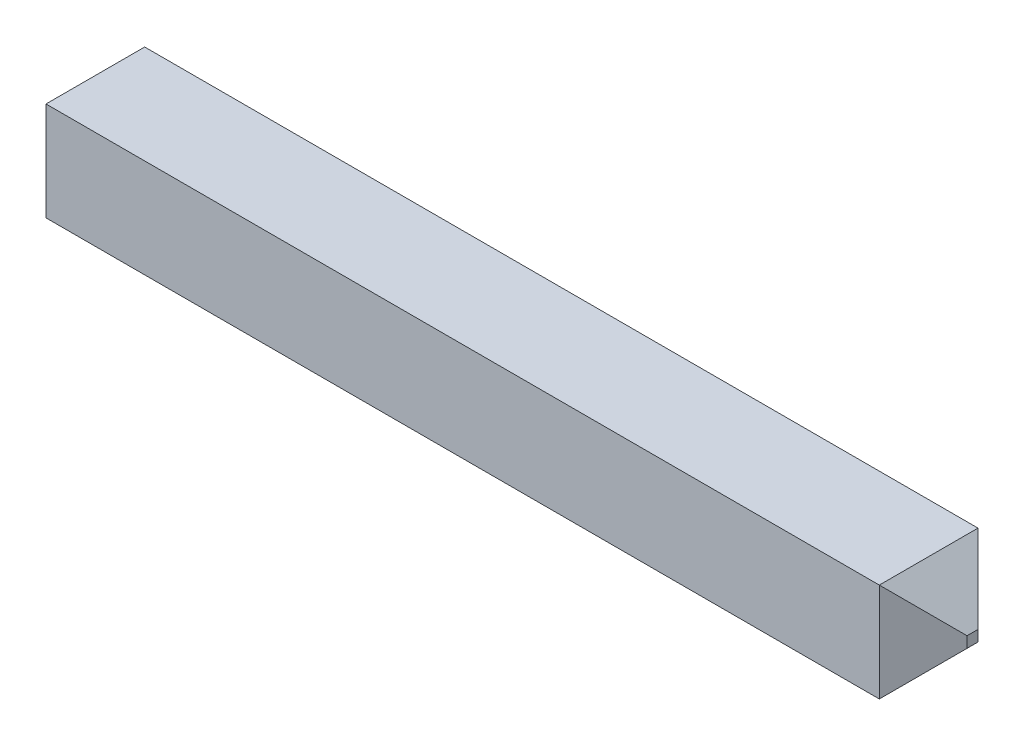
ISO-10303-21;
HEADER;
FILE_DESCRIPTION(('STEP AP214'),'2;1');
FILE_NAME('part.step','',(''),(''),'','','');
FILE_SCHEMA(('AUTOMOTIVE_DESIGN { 1 0 10303 214 1 1 1 1 }'));
ENDSEC;
DATA;
#1=APPLICATION_CONTEXT('core data for automotive mechanical design processes');
#2=APPLICATION_PROTOCOL_DEFINITION('international standard','automotive_design',2000,#1);
#3=PRODUCT_CONTEXT('',#1,'mechanical');
#4=PRODUCT('Part','Part','',(#3));
#5=PRODUCT_RELATED_PRODUCT_CATEGORY('part','',(#4));
#6=PRODUCT_DEFINITION_FORMATION('','',#4);
#7=PRODUCT_DEFINITION_CONTEXT('part definition',#1,'design');
#8=PRODUCT_DEFINITION('design','',#6,#7);
#9=PRODUCT_DEFINITION_SHAPE('','',#8);
#10=(LENGTH_UNIT() NAMED_UNIT(*) SI_UNIT(.MILLI.,.METRE.));
#11=(NAMED_UNIT(*) PLANE_ANGLE_UNIT() SI_UNIT($,.RADIAN.));
#12=(NAMED_UNIT(*) SI_UNIT($,.STERADIAN.) SOLID_ANGLE_UNIT());
#13=UNCERTAINTY_MEASURE_WITH_UNIT(LENGTH_MEASURE(1.E-05),#10,'distance_accuracy_value','');
#14=(GEOMETRIC_REPRESENTATION_CONTEXT(3) GLOBAL_UNCERTAINTY_ASSIGNED_CONTEXT((#13)) GLOBAL_UNIT_ASSIGNED_CONTEXT((#10,
#11,#12)) REPRESENTATION_CONTEXT('',''));
#15=CARTESIAN_POINT('',(0.,0.,0.));
#16=DIRECTION('',(0.,0.,1.));
#17=DIRECTION('',(1.,0.,0.));
#18=AXIS2_PLACEMENT_3D('',#15,#16,#17);
#19=CARTESIAN_POINT('',(0.,-0.225,0.225));
#20=DIRECTION('',(-1.,0.,0.));
#21=DIRECTION('',(0.,0.,1.));
#22=AXIS2_PLACEMENT_3D('',#19,#20,#21);
#23=PLANE('',#22);
#24=DIRECTION('',(0.,1.,0.));
#25=VECTOR('',#24,1.);
#26=CARTESIAN_POINT('',(0.,-0.225,-0.225));
#27=LINE('',#26,#25);
#28=CARTESIAN_POINT('',(0.,-0.225,-0.225));
#29=VERTEX_POINT('',#28);
#30=CARTESIAN_POINT('',(0.,0.225,-0.225));
#31=VERTEX_POINT('',#30);
#32=EDGE_CURVE('E114',#29,#31,#27,.T.);
#33=ORIENTED_EDGE('',*,*,#32,.F.);
#34=DIRECTION('',(0.,0.,-1.));
#35=VECTOR('',#34,1.);
#36=CARTESIAN_POINT('',(0.,-0.225,0.225));
#37=LINE('',#36,#35);
#38=CARTESIAN_POINT('',(0.,-0.225,0.225));
#39=VERTEX_POINT('',#38);
#40=EDGE_CURVE('E100',#39,#29,#37,.T.);
#41=ORIENTED_EDGE('',*,*,#40,.F.);
#42=DIRECTION('',(0.,1.,0.));
#43=VECTOR('',#42,1.);
#44=CARTESIAN_POINT('',(0.,-0.225,0.225));
#45=LINE('',#44,#43);
#46=CARTESIAN_POINT('',(0.,0.225,0.225));
#47=VERTEX_POINT('',#46);
#48=EDGE_CURVE('E105',#39,#47,#45,.T.);
#49=ORIENTED_EDGE('',*,*,#48,.T.);
#50=DIRECTION('',(0.,0.,-1.));
#51=VECTOR('',#50,1.);
#52=CARTESIAN_POINT('',(0.,0.225,0.225));
#53=LINE('',#52,#51);
#54=EDGE_CURVE('E90',#47,#31,#53,.T.);
#55=ORIENTED_EDGE('',*,*,#54,.T.);
#56=EDGE_LOOP('',(#33,#41,#49,#55));
#57=FACE_BOUND('',#56,.T.);
#58=ADVANCED_FACE('F35',(#57),#23,.T.);
#59=CARTESIAN_POINT('',(4.,-0.225000000000001,0.225));
#60=DIRECTION('',(0.,-1.,0.));
#61=DIRECTION('',(0.,0.,-1.));
#62=AXIS2_PLACEMENT_3D('',#59,#60,#61);
#63=PLANE('',#62);
#64=DIRECTION('',(-1.,0.,0.));
#65=VECTOR('',#64,1.);
#66=CARTESIAN_POINT('',(4.,-0.225000000000001,-0.224999999999999));
#67=LINE('',#66,#65);
#68=CARTESIAN_POINT('',(3.8,-0.225000000000001,-0.224999999999999));
#69=VERTEX_POINT('',#68);
#70=EDGE_CURVE('E109',#69,#29,#67,.T.);
#71=ORIENTED_EDGE('',*,*,#70,.F.);
#72=DIRECTION('',(0.,0.,1.));
#73=VECTOR('',#72,1.);
#74=CARTESIAN_POINT('',(3.8,-0.225000000000001,0.225));
#75=LINE('',#74,#73);
#76=CARTESIAN_POINT('',(3.8,-0.225000000000001,0.225));
#77=VERTEX_POINT('',#76);
#78=EDGE_CURVE('E59',#69,#77,#75,.T.);
#79=ORIENTED_EDGE('',*,*,#78,.T.);
#80=DIRECTION('',(-1.,0.,0.));
#81=VECTOR('',#80,1.);
#82=CARTESIAN_POINT('',(4.,-0.225000000000001,0.225));
#83=LINE('',#82,#81);
#84=EDGE_CURVE('E101',#77,#39,#83,.T.);
#85=ORIENTED_EDGE('',*,*,#84,.T.);
#86=ORIENTED_EDGE('',*,*,#40,.T.);
#87=EDGE_LOOP('',(#71,#79,#85,#86));
#88=FACE_BOUND('',#87,.T.);
#89=ADVANCED_FACE('F158',(#88),#63,.T.);
#90=CARTESIAN_POINT('',(4.,0.224999999999999,0.225));
#91=DIRECTION('',(1.,0.,0.));
#92=DIRECTION('',(0.,0.,-1.));
#93=AXIS2_PLACEMENT_3D('',#90,#91,#92);
#94=PLANE('',#93);
#95=DIRECTION('',(0.,0.,-1.));
#96=VECTOR('',#95,1.);
#97=CARTESIAN_POINT('',(4.,-0.0250000000000001,0.225));
#98=LINE('',#97,#96);
#99=CARTESIAN_POINT('',(4.,-0.0250000000000002,0.0249999999999997));
#100=VERTEX_POINT('',#99);
#101=CARTESIAN_POINT('',(4.,-0.0250000000000002,-0.0249999999999989));
#102=VERTEX_POINT('',#101);
#103=EDGE_CURVE('E125',#100,#102,#98,.T.);
#104=ORIENTED_EDGE('',*,*,#103,.T.);
#105=DIRECTION('',(0.,1.,0.));
#106=VECTOR('',#105,1.);
#107=CARTESIAN_POINT('',(4.,0.224999999999999,-0.024999999999999));
#108=LINE('',#107,#106);
#109=CARTESIAN_POINT('',(4.,0.0249999999999986,-0.0249999999999989));
#110=VERTEX_POINT('',#109);
#111=EDGE_CURVE('E127',#102,#110,#108,.T.);
#112=ORIENTED_EDGE('',*,*,#111,.T.);
#113=DIRECTION('',(0.,0.,1.));
#114=VECTOR('',#113,1.);
#115=CARTESIAN_POINT('',(4.,0.0249999999999987,0.225));
#116=LINE('',#115,#114);
#117=CARTESIAN_POINT('',(4.,0.0249999999999986,0.0249999999999997));
#118=VERTEX_POINT('',#117);
#119=EDGE_CURVE('E123',#110,#118,#116,.T.);
#120=ORIENTED_EDGE('',*,*,#119,.T.);
#121=DIRECTION('',(0.,-1.,0.));
#122=VECTOR('',#121,1.);
#123=CARTESIAN_POINT('',(4.,-0.225000000000001,0.0249999999999998));
#124=LINE('',#123,#122);
#125=EDGE_CURVE('E121',#118,#100,#124,.T.);
#126=ORIENTED_EDGE('',*,*,#125,.T.);
#127=EDGE_LOOP('',(#104,#112,#120,#126));
#128=FACE_BOUND('',#127,.T.);
#129=ADVANCED_FACE('F149',(#128),#94,.T.);
#130=CARTESIAN_POINT('',(0.,0.225,0.225));
#131=DIRECTION('',(0.,1.,0.));
#132=DIRECTION('',(0.,0.,1.));
#133=AXIS2_PLACEMENT_3D('',#130,#131,#132);
#134=PLANE('',#133);
#135=DIRECTION('',(1.,0.,0.));
#136=VECTOR('',#135,1.);
#137=CARTESIAN_POINT('',(0.,0.225,0.225));
#138=LINE('',#137,#136);
#139=CARTESIAN_POINT('',(3.8,0.224999999999999,0.225));
#140=VERTEX_POINT('',#139);
#141=EDGE_CURVE('E92',#47,#140,#138,.T.);
#142=ORIENTED_EDGE('',*,*,#141,.T.);
#143=DIRECTION('',(0.,0.,-1.));
#144=VECTOR('',#143,1.);
#145=CARTESIAN_POINT('',(3.8,0.224999999999999,0.225));
#146=LINE('',#145,#144);
#147=CARTESIAN_POINT('',(3.8,0.224999999999999,-0.225));
#148=VERTEX_POINT('',#147);
#149=EDGE_CURVE('E45',#140,#148,#146,.T.);
#150=ORIENTED_EDGE('',*,*,#149,.T.);
#151=DIRECTION('',(1.,0.,0.));
#152=VECTOR('',#151,1.);
#153=CARTESIAN_POINT('',(0.,0.225,-0.225));
#154=LINE('',#153,#152);
#155=EDGE_CURVE('E95',#31,#148,#154,.T.);
#156=ORIENTED_EDGE('',*,*,#155,.F.);
#157=ORIENTED_EDGE('',*,*,#54,.F.);
#158=EDGE_LOOP('',(#142,#150,#156,#157));
#159=FACE_BOUND('',#158,.T.);
#160=ADVANCED_FACE('F91',(#159),#134,.T.);
#161=CARTESIAN_POINT('',(0.,0.,0.225));
#162=DIRECTION('',(0.,0.,-1.));
#163=DIRECTION('',(0.,1.,0.));
#164=AXIS2_PLACEMENT_3D('',#161,#162,#163);
#165=PLANE('',#164);
#166=ORIENTED_EDGE('',*,*,#84,.F.);
#167=DIRECTION('',(0.,1.,0.));
#168=VECTOR('',#167,1.);
#169=CARTESIAN_POINT('',(3.8,0.224999999999999,0.225));
#170=LINE('',#169,#168);
#171=EDGE_CURVE('E11',#77,#140,#170,.T.);
#172=ORIENTED_EDGE('',*,*,#171,.T.);
#173=ORIENTED_EDGE('',*,*,#141,.F.);
#174=ORIENTED_EDGE('',*,*,#48,.F.);
#175=EDGE_LOOP('',(#166,#172,#173,#174));
#176=FACE_BOUND('',#175,.T.);
#177=ADVANCED_FACE('F104',(#176),#165,.F.);
#178=CARTESIAN_POINT('',(0.,0.,-0.225));
#179=DIRECTION('',(0.,0.,-1.));
#180=DIRECTION('',(0.,1.,0.));
#181=AXIS2_PLACEMENT_3D('',#178,#179,#180);
#182=PLANE('',#181);
#183=ORIENTED_EDGE('',*,*,#155,.T.);
#184=DIRECTION('',(0.,-1.,0.));
#185=VECTOR('',#184,1.);
#186=CARTESIAN_POINT('',(3.8,0.,-0.225));
#187=LINE('',#186,#185);
#188=EDGE_CURVE('E117',#148,#69,#187,.T.);
#189=ORIENTED_EDGE('',*,*,#188,.T.);
#190=ORIENTED_EDGE('',*,*,#70,.T.);
#191=ORIENTED_EDGE('',*,*,#32,.T.);
#192=EDGE_LOOP('',(#183,#189,#190,#191));
#193=FACE_BOUND('',#192,.T.);
#194=ADVANCED_FACE('F157',(#193),#182,.T.);
#195=CARTESIAN_POINT('',(4.,0.224999999999999,0.0249999999999997));
#196=DIRECTION('',(0.707106781186546,0.,0.707106781186549));
#197=DIRECTION('',(0.,1.,0.));
#198=AXIS2_PLACEMENT_3D('',#195,#196,#197);
#199=PLANE('',#198);
#200=DIRECTION('',(-0.577350269189627,-0.577350269189625,0.577350269189625));
#201=VECTOR('',#200,1.);
#202=CARTESIAN_POINT('',(4.08333333333333,0.0583333333333327,-0.0583333333333331));
#203=LINE('',#202,#201);
#204=EDGE_CURVE('E135',#100,#77,#203,.T.);
#205=ORIENTED_EDGE('',*,*,#204,.F.);
#206=ORIENTED_EDGE('',*,*,#125,.F.);
#207=DIRECTION('',(0.577350269189627,-0.577350269189625,-0.577350269189625));
#208=VECTOR('',#207,1.);
#209=CARTESIAN_POINT('',(3.93333333333333,0.0916666666666653,0.0916666666666663));
#210=LINE('',#209,#208);
#211=EDGE_CURVE('E40',#140,#118,#210,.T.);
#212=ORIENTED_EDGE('',*,*,#211,.F.);
#213=ORIENTED_EDGE('',*,*,#171,.F.);
#214=EDGE_LOOP('',(#205,#206,#212,#213));
#215=FACE_BOUND('',#214,.T.);
#216=ADVANCED_FACE('F38',(#215),#199,.T.);
#217=CARTESIAN_POINT('',(3.8,0.224999999999999,0.225));
#218=DIRECTION('',(-0.707106781186546,-0.707106781186549,0.));
#219=DIRECTION('',(0.,0.,-1.));
#220=AXIS2_PLACEMENT_3D('',#217,#218,#219);
#221=PLANE('',#220);
#222=ORIENTED_EDGE('',*,*,#211,.T.);
#223=ORIENTED_EDGE('',*,*,#119,.F.);
#224=DIRECTION('',(-0.577350269189627,0.577350269189625,-0.577350269189625));
#225=VECTOR('',#224,1.);
#226=CARTESIAN_POINT('',(3.95,0.0749999999999997,-0.075));
#227=LINE('',#226,#225);
#228=EDGE_CURVE('E134',#148,#110,#227,.F.);
#229=ORIENTED_EDGE('',*,*,#228,.F.);
#230=ORIENTED_EDGE('',*,*,#149,.F.);
#231=EDGE_LOOP('',(#222,#223,#229,#230));
#232=FACE_BOUND('',#231,.T.);
#233=ADVANCED_FACE('F144',(#232),#221,.F.);
#234=CARTESIAN_POINT('',(4.,-0.0250000000000001,0.225));
#235=DIRECTION('',(-0.707106781186546,0.707106781186549,0.));
#236=DIRECTION('',(0.,0.,-1.));
#237=AXIS2_PLACEMENT_3D('',#234,#235,#236);
#238=PLANE('',#237);
#239=ORIENTED_EDGE('',*,*,#204,.T.);
#240=ORIENTED_EDGE('',*,*,#78,.F.);
#241=DIRECTION('',(0.577350269189627,0.577350269189625,0.577350269189625));
#242=VECTOR('',#241,1.);
#243=CARTESIAN_POINT('',(4.08333333333333,0.0583333333333326,0.058333333333334));
#244=LINE('',#243,#242);
#245=EDGE_CURVE('E132',#102,#69,#244,.F.);
#246=ORIENTED_EDGE('',*,*,#245,.F.);
#247=ORIENTED_EDGE('',*,*,#103,.F.);
#248=EDGE_LOOP('',(#239,#240,#246,#247));
#249=FACE_BOUND('',#248,.T.);
#250=ADVANCED_FACE('F155',(#249),#238,.F.);
#251=CARTESIAN_POINT('',(3.8,0.,-0.225));
#252=DIRECTION('',(-0.707106781186546,0.,0.707106781186549));
#253=DIRECTION('',(0.,-1.,0.));
#254=AXIS2_PLACEMENT_3D('',#251,#252,#253);
#255=PLANE('',#254);
#256=ORIENTED_EDGE('',*,*,#228,.T.);
#257=ORIENTED_EDGE('',*,*,#111,.F.);
#258=ORIENTED_EDGE('',*,*,#245,.T.);
#259=ORIENTED_EDGE('',*,*,#188,.F.);
#260=EDGE_LOOP('',(#256,#257,#258,#259));
#261=FACE_BOUND('',#260,.T.);
#262=ADVANCED_FACE('F153',(#261),#255,.F.);
#263=CLOSED_SHELL('',(#58,#89,#129,#160,#177,#194,#216,#233,#250,#262));
#264=MANIFOLD_SOLID_BREP('B2',#263);
#265=ADVANCED_BREP_SHAPE_REPRESENTATION('',(#18,#264),#14);
#266=SHAPE_DEFINITION_REPRESENTATION(#9,#265);
ENDSEC;
END-ISO-10303-21;
